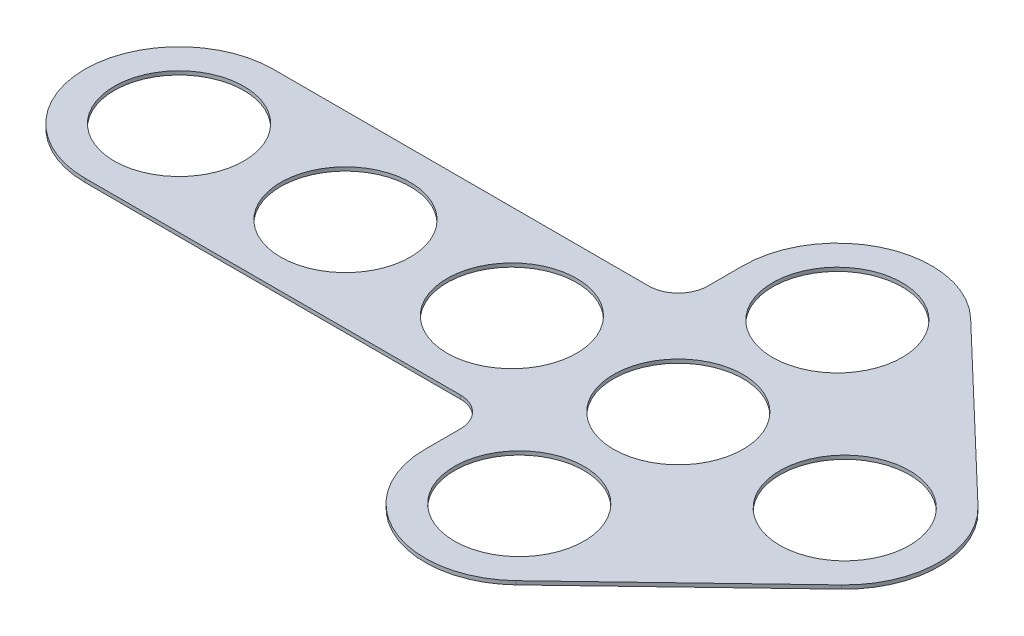
ISO-10303-21;
HEADER;
FILE_DESCRIPTION(('STEP AP214'),'2;1');
FILE_NAME('part.step','',(''),(''),'','','');
FILE_SCHEMA(('AUTOMOTIVE_DESIGN { 1 0 10303 214 1 1 1 1 }'));
ENDSEC;
DATA;
#1=APPLICATION_CONTEXT('core data for automotive mechanical design processes');
#2=APPLICATION_PROTOCOL_DEFINITION('international standard','automotive_design',2000,#1);
#3=PRODUCT_CONTEXT('',#1,'mechanical');
#4=PRODUCT('Part','Part','',(#3));
#5=PRODUCT_RELATED_PRODUCT_CATEGORY('part','',(#4));
#6=PRODUCT_DEFINITION_FORMATION('','',#4);
#7=PRODUCT_DEFINITION_CONTEXT('part definition',#1,'design');
#8=PRODUCT_DEFINITION('design','',#6,#7);
#9=PRODUCT_DEFINITION_SHAPE('','',#8);
#10=(LENGTH_UNIT() NAMED_UNIT(*) SI_UNIT(.MILLI.,.METRE.));
#11=(NAMED_UNIT(*) PLANE_ANGLE_UNIT() SI_UNIT($,.RADIAN.));
#12=(NAMED_UNIT(*) SI_UNIT($,.STERADIAN.) SOLID_ANGLE_UNIT());
#13=UNCERTAINTY_MEASURE_WITH_UNIT(LENGTH_MEASURE(1.E-05),#10,'distance_accuracy_value','');
#14=(GEOMETRIC_REPRESENTATION_CONTEXT(3) GLOBAL_UNCERTAINTY_ASSIGNED_CONTEXT((#13)) GLOBAL_UNIT_ASSIGNED_CONTEXT((#10,
#11,#12)) REPRESENTATION_CONTEXT('',''));
#15=CARTESIAN_POINT('',(0.,0.,0.));
#16=DIRECTION('',(0.,0.,1.));
#17=DIRECTION('',(1.,0.,0.));
#18=AXIS2_PLACEMENT_3D('',#15,#16,#17);
#19=CARTESIAN_POINT('',(518.16,3.175,-365.76));
#20=DIRECTION('',(0.,1.,0.));
#21=DIRECTION('',(0.,0.,1.));
#22=AXIS2_PLACEMENT_3D('',#19,#20,#21);
#23=PLANE('',#22);
#24=CARTESIAN_POINT('',(518.16,3.175,-365.76));
#25=DIRECTION('',(0.,1.,0.));
#26=DIRECTION('',(0.,0.,1.));
#27=AXIS2_PLACEMENT_3D('',#24,#25,#26);
#28=CIRCLE('',#27,55.88);
#29=CARTESIAN_POINT('',(518.16,3.175,-309.88));
#30=VERTEX_POINT('',#29);
#31=EDGE_CURVE('E424',#30,#30,#28,.T.);
#32=ORIENTED_EDGE('',*,*,#31,.F.);
#33=EDGE_LOOP('',(#32));
#34=FACE_BOUND('',#33,.T.);
#35=CARTESIAN_POINT('',(518.16,3.175,-228.6));
#36=DIRECTION('',(0.,1.,0.));
#37=DIRECTION('',(0.,0.,1.));
#38=AXIS2_PLACEMENT_3D('',#35,#36,#37);
#39=CIRCLE('',#38,55.88);
#40=CARTESIAN_POINT('',(518.16,3.175,-172.72));
#41=VERTEX_POINT('',#40);
#42=EDGE_CURVE('E443',#41,#41,#39,.T.);
#43=ORIENTED_EDGE('',*,*,#42,.F.);
#44=EDGE_LOOP('',(#43));
#45=FACE_BOUND('',#44,.T.);
#46=CARTESIAN_POINT('',(231.14,3.175,-228.6));
#47=DIRECTION('',(0.,1.,0.));
#48=DIRECTION('',(0.,0.,1.));
#49=AXIS2_PLACEMENT_3D('',#46,#47,#48);
#50=CIRCLE('',#49,55.88);
#51=CARTESIAN_POINT('',(231.14,3.175,-172.72));
#52=VERTEX_POINT('',#51);
#53=EDGE_CURVE('E455',#52,#52,#50,.T.);
#54=ORIENTED_EDGE('',*,*,#53,.F.);
#55=EDGE_LOOP('',(#54));
#56=FACE_BOUND('',#55,.T.);
#57=DIRECTION('',(0.,0.,1.));
#58=VECTOR('',#57,1.);
#59=CARTESIAN_POINT('',(436.88,3.175,-309.88));
#60=LINE('',#59,#58);
#61=CARTESIAN_POINT('',(436.88,3.175,-365.76));
#62=VERTEX_POINT('',#61);
#63=CARTESIAN_POINT('',(436.88,3.175,-335.28));
#64=VERTEX_POINT('',#63);
#65=EDGE_CURVE('E133',#62,#64,#60,.T.);
#66=ORIENTED_EDGE('',*,*,#65,.T.);
#67=CARTESIAN_POINT('',(411.48,3.175,-335.28));
#68=DIRECTION('',(0.,1.,0.));
#69=DIRECTION('',(0.,0.,1.));
#70=AXIS2_PLACEMENT_3D('',#67,#68,#69);
#71=CIRCLE('',#70,25.4);
#72=CARTESIAN_POINT('',(411.48,3.175,-309.88));
#73=VERTEX_POINT('',#72);
#74=EDGE_CURVE('E129',#64,#73,#71,.F.);
#75=ORIENTED_EDGE('',*,*,#74,.T.);
#76=DIRECTION('',(-1.,0.,0.));
#77=VECTOR('',#76,1.);
#78=CARTESIAN_POINT('',(87.63,3.175,-309.88));
#79=LINE('',#78,#77);
#80=CARTESIAN_POINT('',(87.63,3.175,-309.88));
#81=VERTEX_POINT('',#80);
#82=EDGE_CURVE('E121',#73,#81,#79,.T.);
#83=ORIENTED_EDGE('',*,*,#82,.T.);
#84=CARTESIAN_POINT('',(87.63,3.175,-228.6));
#85=DIRECTION('',(0.,1.,0.));
#86=DIRECTION('',(0.,0.,1.));
#87=AXIS2_PLACEMENT_3D('',#84,#85,#86);
#88=CIRCLE('',#87,81.28);
#89=CARTESIAN_POINT('',(87.63,3.175,-147.32));
#90=VERTEX_POINT('',#89);
#91=EDGE_CURVE('E126',#81,#90,#88,.T.);
#92=ORIENTED_EDGE('',*,*,#91,.T.);
#93=DIRECTION('',(1.,0.,0.));
#94=VECTOR('',#93,1.);
#95=CARTESIAN_POINT('',(436.88,3.175,-147.32));
#96=LINE('',#95,#94);
#97=CARTESIAN_POINT('',(411.48,3.175,-147.32));
#98=VERTEX_POINT('',#97);
#99=EDGE_CURVE('E147',#90,#98,#96,.T.);
#100=ORIENTED_EDGE('',*,*,#99,.T.);
#101=CARTESIAN_POINT('',(411.48,3.175,-121.92));
#102=DIRECTION('',(0.,1.,0.));
#103=DIRECTION('',(0.,0.,1.));
#104=AXIS2_PLACEMENT_3D('',#101,#102,#103);
#105=CIRCLE('',#104,25.4);
#106=CARTESIAN_POINT('',(436.88,3.175,-121.92));
#107=VERTEX_POINT('',#106);
#108=EDGE_CURVE('E11',#98,#107,#105,.F.);
#109=ORIENTED_EDGE('',*,*,#108,.T.);
#110=DIRECTION('',(0.,0.,1.));
#111=VECTOR('',#110,1.);
#112=CARTESIAN_POINT('',(436.88,3.175,-91.44));
#113=LINE('',#112,#111);
#114=CARTESIAN_POINT('',(436.88,3.175,-91.44));
#115=VERTEX_POINT('',#114);
#116=EDGE_CURVE('E149',#107,#115,#113,.T.);
#117=ORIENTED_EDGE('',*,*,#116,.T.);
#118=CARTESIAN_POINT('',(518.16,3.175,-91.44));
#119=DIRECTION('',(0.,1.,0.));
#120=DIRECTION('',(0.,0.,1.));
#121=AXIS2_PLACEMENT_3D('',#118,#119,#120);
#122=CIRCLE('',#121,81.2799999999999);
#123=CARTESIAN_POINT('',(574.31895953121,3.175,-32.6810886386417));
#124=VERTEX_POINT('',#123);
#125=EDGE_CURVE('E154',#115,#124,#122,.T.);
#126=ORIENTED_EDGE('',*,*,#125,.T.);
#127=DIRECTION('',(0.722919677182066,0.,-0.690932080846575));
#128=VECTOR('',#127,1.);
#129=CARTESIAN_POINT('',(717.82895953121,3.175,-169.841088638642));
#130=LINE('',#129,#128);
#131=CARTESIAN_POINT('',(717.82895953121,3.175,-169.841088638642));
#132=VERTEX_POINT('',#131);
#133=EDGE_CURVE('E156',#124,#132,#130,.T.);
#134=ORIENTED_EDGE('',*,*,#133,.T.);
#135=CARTESIAN_POINT('',(661.67,3.175,-228.6));
#136=DIRECTION('',(0.,1.,0.));
#137=DIRECTION('',(0.,0.,1.));
#138=AXIS2_PLACEMENT_3D('',#135,#136,#137);
#139=CIRCLE('',#138,81.28);
#140=CARTESIAN_POINT('',(717.82895953121,3.175,-287.358911361358));
#141=VERTEX_POINT('',#140);
#142=EDGE_CURVE('E158',#132,#141,#139,.T.);
#143=ORIENTED_EDGE('',*,*,#142,.T.);
#144=DIRECTION('',(-0.722919677182065,0.,-0.690932080846575));
#145=VECTOR('',#144,1.);
#146=CARTESIAN_POINT('',(574.31895953121,3.175,-424.518911361358));
#147=LINE('',#146,#145);
#148=CARTESIAN_POINT('',(574.31895953121,3.175,-424.518911361358));
#149=VERTEX_POINT('',#148);
#150=EDGE_CURVE('E160',#141,#149,#147,.T.);
#151=ORIENTED_EDGE('',*,*,#150,.T.);
#152=CARTESIAN_POINT('',(518.16,3.175,-365.76));
#153=DIRECTION('',(0.,1.,0.));
#154=DIRECTION('',(0.,0.,1.));
#155=AXIS2_PLACEMENT_3D('',#152,#153,#154);
#156=CIRCLE('',#155,81.28);
#157=EDGE_CURVE('E162',#149,#62,#156,.T.);
#158=ORIENTED_EDGE('',*,*,#157,.T.);
#159=EDGE_LOOP('',(#66,#75,#83,#92,#100,#109,#117,#126,#134,#143,#151,#158));
#160=FACE_BOUND('',#159,.T.);
#161=CARTESIAN_POINT('',(87.63,3.175,-228.6));
#162=DIRECTION('',(0.,1.,0.));
#163=DIRECTION('',(0.,0.,1.));
#164=AXIS2_PLACEMENT_3D('',#161,#162,#163);
#165=CIRCLE('',#164,55.88);
#166=CARTESIAN_POINT('',(87.63,3.175,-172.72));
#167=VERTEX_POINT('',#166);
#168=EDGE_CURVE('E168',#167,#167,#165,.T.);
#169=ORIENTED_EDGE('',*,*,#168,.F.);
#170=EDGE_LOOP('',(#169));
#171=FACE_BOUND('',#170,.T.);
#172=CARTESIAN_POINT('',(374.65,3.175,-228.6));
#173=DIRECTION('',(0.,1.,0.));
#174=DIRECTION('',(0.,0.,1.));
#175=AXIS2_PLACEMENT_3D('',#172,#173,#174);
#176=CIRCLE('',#175,55.88);
#177=CARTESIAN_POINT('',(374.65,3.175,-172.72));
#178=VERTEX_POINT('',#177);
#179=EDGE_CURVE('E449',#178,#178,#176,.T.);
#180=ORIENTED_EDGE('',*,*,#179,.F.);
#181=EDGE_LOOP('',(#180));
#182=FACE_BOUND('',#181,.T.);
#183=CARTESIAN_POINT('',(661.67,3.175,-228.6));
#184=DIRECTION('',(0.,1.,0.));
#185=DIRECTION('',(0.,0.,1.));
#186=AXIS2_PLACEMENT_3D('',#183,#184,#185);
#187=CIRCLE('',#186,55.88);
#188=CARTESIAN_POINT('',(661.67,3.175,-172.72));
#189=VERTEX_POINT('',#188);
#190=EDGE_CURVE('E437',#189,#189,#187,.T.);
#191=ORIENTED_EDGE('',*,*,#190,.F.);
#192=EDGE_LOOP('',(#191));
#193=FACE_BOUND('',#192,.T.);
#194=CARTESIAN_POINT('',(518.16,3.175,-91.44));
#195=DIRECTION('',(0.,1.,0.));
#196=DIRECTION('',(0.,0.,1.));
#197=AXIS2_PLACEMENT_3D('',#194,#195,#196);
#198=CIRCLE('',#197,55.88);
#199=CARTESIAN_POINT('',(518.16,3.175,-35.56));
#200=VERTEX_POINT('',#199);
#201=EDGE_CURVE('E428',#200,#200,#198,.T.);
#202=ORIENTED_EDGE('',*,*,#201,.F.);
#203=EDGE_LOOP('',(#202));
#204=FACE_BOUND('',#203,.T.);
#205=ADVANCED_FACE('F33',(#34,#45,#56,#160,#171,#182,#193,#204),#23,.T.);
#206=CARTESIAN_POINT('',(518.16,0.,-365.76));
#207=DIRECTION('',(0.,1.,0.));
#208=DIRECTION('',(0.,0.,1.));
#209=AXIS2_PLACEMENT_3D('',#206,#207,#208);
#210=PLANE('',#209);
#211=CARTESIAN_POINT('',(518.16,0.,-365.76));
#212=DIRECTION('',(0.,1.,0.));
#213=DIRECTION('',(0.,0.,1.));
#214=AXIS2_PLACEMENT_3D('',#211,#212,#213);
#215=CIRCLE('',#214,55.88);
#216=CARTESIAN_POINT('',(518.16,0.,-309.88));
#217=VERTEX_POINT('',#216);
#218=EDGE_CURVE('E427',#217,#217,#215,.T.);
#219=ORIENTED_EDGE('',*,*,#218,.T.);
#220=EDGE_LOOP('',(#219));
#221=FACE_BOUND('',#220,.T.);
#222=CARTESIAN_POINT('',(518.16,0.,-228.6));
#223=DIRECTION('',(0.,1.,0.));
#224=DIRECTION('',(0.,0.,1.));
#225=AXIS2_PLACEMENT_3D('',#222,#223,#224);
#226=CIRCLE('',#225,55.88);
#227=CARTESIAN_POINT('',(518.16,0.,-172.72));
#228=VERTEX_POINT('',#227);
#229=EDGE_CURVE('E440',#228,#228,#226,.T.);
#230=ORIENTED_EDGE('',*,*,#229,.T.);
#231=EDGE_LOOP('',(#230));
#232=FACE_BOUND('',#231,.T.);
#233=CARTESIAN_POINT('',(231.14,0.,-228.6));
#234=DIRECTION('',(0.,1.,0.));
#235=DIRECTION('',(0.,0.,1.));
#236=AXIS2_PLACEMENT_3D('',#233,#234,#235);
#237=CIRCLE('',#236,55.88);
#238=CARTESIAN_POINT('',(231.14,0.,-172.72));
#239=VERTEX_POINT('',#238);
#240=EDGE_CURVE('E452',#239,#239,#237,.T.);
#241=ORIENTED_EDGE('',*,*,#240,.T.);
#242=EDGE_LOOP('',(#241));
#243=FACE_BOUND('',#242,.T.);
#244=DIRECTION('',(0.,0.,1.));
#245=VECTOR('',#244,1.);
#246=CARTESIAN_POINT('',(436.88,0.,-309.88));
#247=LINE('',#246,#245);
#248=CARTESIAN_POINT('',(436.88,0.,-365.76));
#249=VERTEX_POINT('',#248);
#250=CARTESIAN_POINT('',(436.88,0.,-335.28));
#251=VERTEX_POINT('',#250);
#252=EDGE_CURVE('E165',#249,#251,#247,.T.);
#253=ORIENTED_EDGE('',*,*,#252,.F.);
#254=CARTESIAN_POINT('',(518.16,0.,-365.76));
#255=DIRECTION('',(0.,1.,0.));
#256=DIRECTION('',(0.,0.,1.));
#257=AXIS2_PLACEMENT_3D('',#254,#255,#256);
#258=CIRCLE('',#257,81.28);
#259=CARTESIAN_POINT('',(574.31895953121,0.,-424.518911361358));
#260=VERTEX_POINT('',#259);
#261=EDGE_CURVE('E184',#260,#249,#258,.T.);
#262=ORIENTED_EDGE('',*,*,#261,.F.);
#263=DIRECTION('',(-0.722919677182065,0.,-0.690932080846575));
#264=VECTOR('',#263,1.);
#265=CARTESIAN_POINT('',(574.31895953121,0.,-424.518911361358));
#266=LINE('',#265,#264);
#267=CARTESIAN_POINT('',(717.82895953121,0.,-287.358911361358));
#268=VERTEX_POINT('',#267);
#269=EDGE_CURVE('E182',#268,#260,#266,.T.);
#270=ORIENTED_EDGE('',*,*,#269,.F.);
#271=CARTESIAN_POINT('',(661.67,0.,-228.6));
#272=DIRECTION('',(0.,1.,0.));
#273=DIRECTION('',(0.,0.,1.));
#274=AXIS2_PLACEMENT_3D('',#271,#272,#273);
#275=CIRCLE('',#274,81.28);
#276=CARTESIAN_POINT('',(717.82895953121,0.,-169.841088638642));
#277=VERTEX_POINT('',#276);
#278=EDGE_CURVE('E180',#277,#268,#275,.T.);
#279=ORIENTED_EDGE('',*,*,#278,.F.);
#280=DIRECTION('',(0.722919677182066,0.,-0.690932080846575));
#281=VECTOR('',#280,1.);
#282=CARTESIAN_POINT('',(717.82895953121,0.,-169.841088638642));
#283=LINE('',#282,#281);
#284=CARTESIAN_POINT('',(574.31895953121,0.,-32.6810886386417));
#285=VERTEX_POINT('',#284);
#286=EDGE_CURVE('E178',#285,#277,#283,.T.);
#287=ORIENTED_EDGE('',*,*,#286,.F.);
#288=CARTESIAN_POINT('',(518.16,0.,-91.44));
#289=DIRECTION('',(0.,1.,0.));
#290=DIRECTION('',(0.,0.,1.));
#291=AXIS2_PLACEMENT_3D('',#288,#289,#290);
#292=CIRCLE('',#291,81.2799999999999);
#293=CARTESIAN_POINT('',(436.88,0.,-91.44));
#294=VERTEX_POINT('',#293);
#295=EDGE_CURVE('E176',#294,#285,#292,.T.);
#296=ORIENTED_EDGE('',*,*,#295,.F.);
#297=DIRECTION('',(0.,0.,1.));
#298=VECTOR('',#297,1.);
#299=CARTESIAN_POINT('',(436.88,0.,-91.44));
#300=LINE('',#299,#298);
#301=CARTESIAN_POINT('',(436.88,0.,-121.92));
#302=VERTEX_POINT('',#301);
#303=EDGE_CURVE('E174',#302,#294,#300,.T.);
#304=ORIENTED_EDGE('',*,*,#303,.F.);
#305=CARTESIAN_POINT('',(411.48,0.,-121.92));
#306=DIRECTION('',(0.,1.,0.));
#307=DIRECTION('',(0.,0.,1.));
#308=AXIS2_PLACEMENT_3D('',#305,#306,#307);
#309=CIRCLE('',#308,25.4);
#310=CARTESIAN_POINT('',(411.48,0.,-147.32));
#311=VERTEX_POINT('',#310);
#312=EDGE_CURVE('E41',#302,#311,#309,.T.);
#313=ORIENTED_EDGE('',*,*,#312,.T.);
#314=DIRECTION('',(1.,0.,0.));
#315=VECTOR('',#314,1.);
#316=CARTESIAN_POINT('',(436.88,0.,-147.32));
#317=LINE('',#316,#315);
#318=CARTESIAN_POINT('',(87.63,0.,-147.32));
#319=VERTEX_POINT('',#318);
#320=EDGE_CURVE('E172',#319,#311,#317,.T.);
#321=ORIENTED_EDGE('',*,*,#320,.F.);
#322=CARTESIAN_POINT('',(87.63,0.,-228.6));
#323=DIRECTION('',(0.,1.,0.));
#324=DIRECTION('',(0.,0.,1.));
#325=AXIS2_PLACEMENT_3D('',#322,#323,#324);
#326=CIRCLE('',#325,81.28);
#327=CARTESIAN_POINT('',(87.63,0.,-309.88));
#328=VERTEX_POINT('',#327);
#329=EDGE_CURVE('E170',#328,#319,#326,.T.);
#330=ORIENTED_EDGE('',*,*,#329,.F.);
#331=DIRECTION('',(-1.,0.,0.));
#332=VECTOR('',#331,1.);
#333=CARTESIAN_POINT('',(87.63,0.,-309.88));
#334=LINE('',#333,#332);
#335=CARTESIAN_POINT('',(411.48,0.,-309.88));
#336=VERTEX_POINT('',#335);
#337=EDGE_CURVE('E139',#336,#328,#334,.T.);
#338=ORIENTED_EDGE('',*,*,#337,.F.);
#339=CARTESIAN_POINT('',(411.48,0.,-335.28));
#340=DIRECTION('',(0.,1.,0.));
#341=DIRECTION('',(0.,0.,1.));
#342=AXIS2_PLACEMENT_3D('',#339,#340,#341);
#343=CIRCLE('',#342,25.4);
#344=EDGE_CURVE('E211',#336,#251,#343,.T.);
#345=ORIENTED_EDGE('',*,*,#344,.T.);
#346=EDGE_LOOP('',(#253,#262,#270,#279,#287,#296,#304,#313,#321,#330,#338,#345));
#347=FACE_BOUND('',#346,.T.);
#348=CARTESIAN_POINT('',(87.63,0.,-228.6));
#349=DIRECTION('',(0.,1.,0.));
#350=DIRECTION('',(0.,0.,1.));
#351=AXIS2_PLACEMENT_3D('',#348,#349,#350);
#352=CIRCLE('',#351,55.88);
#353=CARTESIAN_POINT('',(87.63,0.,-172.72));
#354=VERTEX_POINT('',#353);
#355=EDGE_CURVE('E458',#354,#354,#352,.T.);
#356=ORIENTED_EDGE('',*,*,#355,.T.);
#357=EDGE_LOOP('',(#356));
#358=FACE_BOUND('',#357,.T.);
#359=CARTESIAN_POINT('',(374.65,0.,-228.6));
#360=DIRECTION('',(0.,1.,0.));
#361=DIRECTION('',(0.,0.,1.));
#362=AXIS2_PLACEMENT_3D('',#359,#360,#361);
#363=CIRCLE('',#362,55.88);
#364=CARTESIAN_POINT('',(374.65,0.,-172.72));
#365=VERTEX_POINT('',#364);
#366=EDGE_CURVE('E446',#365,#365,#363,.T.);
#367=ORIENTED_EDGE('',*,*,#366,.T.);
#368=EDGE_LOOP('',(#367));
#369=FACE_BOUND('',#368,.T.);
#370=CARTESIAN_POINT('',(661.67,0.,-228.6));
#371=DIRECTION('',(0.,1.,0.));
#372=DIRECTION('',(0.,0.,1.));
#373=AXIS2_PLACEMENT_3D('',#370,#371,#372);
#374=CIRCLE('',#373,55.88);
#375=CARTESIAN_POINT('',(661.67,0.,-172.72));
#376=VERTEX_POINT('',#375);
#377=EDGE_CURVE('E430',#376,#376,#374,.T.);
#378=ORIENTED_EDGE('',*,*,#377,.T.);
#379=EDGE_LOOP('',(#378));
#380=FACE_BOUND('',#379,.T.);
#381=CARTESIAN_POINT('',(518.16,0.,-91.44));
#382=DIRECTION('',(0.,1.,0.));
#383=DIRECTION('',(0.,0.,1.));
#384=AXIS2_PLACEMENT_3D('',#381,#382,#383);
#385=CIRCLE('',#384,55.88);
#386=CARTESIAN_POINT('',(518.16,0.,-35.56));
#387=VERTEX_POINT('',#386);
#388=EDGE_CURVE('E433',#387,#387,#385,.T.);
#389=ORIENTED_EDGE('',*,*,#388,.T.);
#390=EDGE_LOOP('',(#389));
#391=FACE_BOUND('',#390,.T.);
#392=ADVANCED_FACE('F214',(#221,#232,#243,#347,#358,#369,#380,#391),#210,.F.);
#393=CARTESIAN_POINT('',(436.88,3.175,-309.88));
#394=DIRECTION('',(1.,0.,0.));
#395=DIRECTION('',(0.,0.,-1.));
#396=AXIS2_PLACEMENT_3D('',#393,#394,#395);
#397=PLANE('',#396);
#398=ORIENTED_EDGE('',*,*,#252,.T.);
#399=DIRECTION('',(0.,-1.,0.));
#400=VECTOR('',#399,1.);
#401=CARTESIAN_POINT('',(436.88,3.175,-335.28));
#402=LINE('',#401,#400);
#403=EDGE_CURVE('E205',#251,#64,#402,.F.);
#404=ORIENTED_EDGE('',*,*,#403,.T.);
#405=ORIENTED_EDGE('',*,*,#65,.F.);
#406=DIRECTION('',(0.,-1.,0.));
#407=VECTOR('',#406,1.);
#408=CARTESIAN_POINT('',(436.88,3.175,-365.76));
#409=LINE('',#408,#407);
#410=EDGE_CURVE('E164',#62,#249,#409,.T.);
#411=ORIENTED_EDGE('',*,*,#410,.T.);
#412=EDGE_LOOP('',(#398,#404,#405,#411));
#413=FACE_BOUND('',#412,.T.);
#414=ADVANCED_FACE('F220',(#413),#397,.F.);
#415=CARTESIAN_POINT('',(87.63,3.175,-309.88));
#416=DIRECTION('',(0.,0.,1.));
#417=DIRECTION('',(1.,0.,0.));
#418=AXIS2_PLACEMENT_3D('',#415,#416,#417);
#419=PLANE('',#418);
#420=ORIENTED_EDGE('',*,*,#82,.F.);
#421=DIRECTION('',(0.,-1.,0.));
#422=VECTOR('',#421,1.);
#423=CARTESIAN_POINT('',(411.48,0.,-309.88));
#424=LINE('',#423,#422);
#425=EDGE_CURVE('E142',#73,#336,#424,.T.);
#426=ORIENTED_EDGE('',*,*,#425,.T.);
#427=ORIENTED_EDGE('',*,*,#337,.T.);
#428=DIRECTION('',(0.,-1.,0.));
#429=VECTOR('',#428,1.);
#430=CARTESIAN_POINT('',(87.63,3.175,-309.88));
#431=LINE('',#430,#429);
#432=EDGE_CURVE('E136',#81,#328,#431,.T.);
#433=ORIENTED_EDGE('',*,*,#432,.F.);
#434=EDGE_LOOP('',(#420,#426,#427,#433));
#435=FACE_BOUND('',#434,.T.);
#436=ADVANCED_FACE('F137',(#435),#419,.F.);
#437=CARTESIAN_POINT('',(87.63,3.175,-228.6));
#438=DIRECTION('',(0.,-1.,0.));
#439=DIRECTION('',(0.,0.,-1.));
#440=AXIS2_PLACEMENT_3D('',#437,#438,#439);
#441=CYLINDRICAL_SURFACE('',#440,81.28);
#442=ORIENTED_EDGE('',*,*,#329,.T.);
#443=DIRECTION('',(0.,-1.,0.));
#444=VECTOR('',#443,1.);
#445=CARTESIAN_POINT('',(87.63,3.175,-147.32));
#446=LINE('',#445,#444);
#447=EDGE_CURVE('E143',#90,#319,#446,.T.);
#448=ORIENTED_EDGE('',*,*,#447,.F.);
#449=ORIENTED_EDGE('',*,*,#91,.F.);
#450=ORIENTED_EDGE('',*,*,#432,.T.);
#451=EDGE_LOOP('',(#442,#448,#449,#450));
#452=FACE_BOUND('',#451,.T.);
#453=ADVANCED_FACE('F145',(#452),#441,.T.);
#454=CARTESIAN_POINT('',(436.88,3.175,-147.32));
#455=DIRECTION('',(0.,0.,-1.));
#456=DIRECTION('',(-1.,0.,0.));
#457=AXIS2_PLACEMENT_3D('',#454,#455,#456);
#458=PLANE('',#457);
#459=ORIENTED_EDGE('',*,*,#320,.T.);
#460=DIRECTION('',(0.,-1.,0.));
#461=VECTOR('',#460,1.);
#462=CARTESIAN_POINT('',(411.48,3.175,-147.32));
#463=LINE('',#462,#461);
#464=EDGE_CURVE('E48',#311,#98,#463,.F.);
#465=ORIENTED_EDGE('',*,*,#464,.T.);
#466=ORIENTED_EDGE('',*,*,#99,.F.);
#467=ORIENTED_EDGE('',*,*,#447,.T.);
#468=EDGE_LOOP('',(#459,#465,#466,#467));
#469=FACE_BOUND('',#468,.T.);
#470=ADVANCED_FACE('F272',(#469),#458,.F.);
#471=CARTESIAN_POINT('',(436.88,3.175,-91.44));
#472=DIRECTION('',(1.,0.,0.));
#473=DIRECTION('',(0.,0.,-1.));
#474=AXIS2_PLACEMENT_3D('',#471,#472,#473);
#475=PLANE('',#474);
#476=ORIENTED_EDGE('',*,*,#116,.F.);
#477=DIRECTION('',(0.,-1.,0.));
#478=VECTOR('',#477,1.);
#479=CARTESIAN_POINT('',(436.88,0.,-121.92));
#480=LINE('',#479,#478);
#481=EDGE_CURVE('E207',#107,#302,#480,.T.);
#482=ORIENTED_EDGE('',*,*,#481,.T.);
#483=ORIENTED_EDGE('',*,*,#303,.T.);
#484=DIRECTION('',(0.,-1.,0.));
#485=VECTOR('',#484,1.);
#486=CARTESIAN_POINT('',(436.88,3.175,-91.44));
#487=LINE('',#486,#485);
#488=EDGE_CURVE('E200',#115,#294,#487,.T.);
#489=ORIENTED_EDGE('',*,*,#488,.F.);
#490=EDGE_LOOP('',(#476,#482,#483,#489));
#491=FACE_BOUND('',#490,.T.);
#492=ADVANCED_FACE('F268',(#491),#475,.F.);
#493=CARTESIAN_POINT('',(518.16,3.175,-91.44));
#494=DIRECTION('',(0.,-1.,0.));
#495=DIRECTION('',(0.,0.,-1.));
#496=AXIS2_PLACEMENT_3D('',#493,#494,#495);
#497=CYLINDRICAL_SURFACE('',#496,81.2799999999999);
#498=ORIENTED_EDGE('',*,*,#295,.T.);
#499=DIRECTION('',(0.,-1.,0.));
#500=VECTOR('',#499,1.);
#501=CARTESIAN_POINT('',(574.31895953121,3.175,-32.6810886386417));
#502=LINE('',#501,#500);
#503=EDGE_CURVE('E197',#124,#285,#502,.T.);
#504=ORIENTED_EDGE('',*,*,#503,.F.);
#505=ORIENTED_EDGE('',*,*,#125,.F.);
#506=ORIENTED_EDGE('',*,*,#488,.T.);
#507=EDGE_LOOP('',(#498,#504,#505,#506));
#508=FACE_BOUND('',#507,.T.);
#509=ADVANCED_FACE('F264',(#508),#497,.T.);
#510=CARTESIAN_POINT('',(717.82895953121,3.175,-169.841088638642));
#511=DIRECTION('',(-0.690932080846575,0.,-0.722919677182066));
#512=DIRECTION('',(-0.722919677182066,0.,0.690932080846575));
#513=AXIS2_PLACEMENT_3D('',#510,#511,#512);
#514=PLANE('',#513);
#515=ORIENTED_EDGE('',*,*,#286,.T.);
#516=DIRECTION('',(0.,-1.,0.));
#517=VECTOR('',#516,1.);
#518=CARTESIAN_POINT('',(717.82895953121,3.175,-169.841088638642));
#519=LINE('',#518,#517);
#520=EDGE_CURVE('E194',#132,#277,#519,.T.);
#521=ORIENTED_EDGE('',*,*,#520,.F.);
#522=ORIENTED_EDGE('',*,*,#133,.F.);
#523=ORIENTED_EDGE('',*,*,#503,.T.);
#524=EDGE_LOOP('',(#515,#521,#522,#523));
#525=FACE_BOUND('',#524,.T.);
#526=ADVANCED_FACE('F260',(#525),#514,.F.);
#527=CARTESIAN_POINT('',(661.67,3.175,-228.6));
#528=DIRECTION('',(0.,-1.,0.));
#529=DIRECTION('',(0.,0.,-1.));
#530=AXIS2_PLACEMENT_3D('',#527,#528,#529);
#531=CYLINDRICAL_SURFACE('',#530,81.28);
#532=ORIENTED_EDGE('',*,*,#278,.T.);
#533=DIRECTION('',(0.,-1.,0.));
#534=VECTOR('',#533,1.);
#535=CARTESIAN_POINT('',(717.82895953121,3.175,-287.358911361358));
#536=LINE('',#535,#534);
#537=EDGE_CURVE('E191',#141,#268,#536,.T.);
#538=ORIENTED_EDGE('',*,*,#537,.F.);
#539=ORIENTED_EDGE('',*,*,#142,.F.);
#540=ORIENTED_EDGE('',*,*,#520,.T.);
#541=EDGE_LOOP('',(#532,#538,#539,#540));
#542=FACE_BOUND('',#541,.T.);
#543=ADVANCED_FACE('F256',(#542),#531,.T.);
#544=CARTESIAN_POINT('',(574.31895953121,3.175,-424.518911361358));
#545=DIRECTION('',(-0.690932080846575,0.,0.722919677182065));
#546=DIRECTION('',(0.722919677182065,0.,0.690932080846575));
#547=AXIS2_PLACEMENT_3D('',#544,#545,#546);
#548=PLANE('',#547);
#549=ORIENTED_EDGE('',*,*,#269,.T.);
#550=DIRECTION('',(0.,-1.,0.));
#551=VECTOR('',#550,1.);
#552=CARTESIAN_POINT('',(574.31895953121,3.175,-424.518911361358));
#553=LINE('',#552,#551);
#554=EDGE_CURVE('E188',#149,#260,#553,.T.);
#555=ORIENTED_EDGE('',*,*,#554,.F.);
#556=ORIENTED_EDGE('',*,*,#150,.F.);
#557=ORIENTED_EDGE('',*,*,#537,.T.);
#558=EDGE_LOOP('',(#549,#555,#556,#557));
#559=FACE_BOUND('',#558,.T.);
#560=ADVANCED_FACE('F252',(#559),#548,.F.);
#561=CARTESIAN_POINT('',(518.16,3.175,-365.76));
#562=DIRECTION('',(0.,-1.,0.));
#563=DIRECTION('',(0.,0.,-1.));
#564=AXIS2_PLACEMENT_3D('',#561,#562,#563);
#565=CYLINDRICAL_SURFACE('',#564,81.28);
#566=ORIENTED_EDGE('',*,*,#261,.T.);
#567=ORIENTED_EDGE('',*,*,#410,.F.);
#568=ORIENTED_EDGE('',*,*,#157,.F.);
#569=ORIENTED_EDGE('',*,*,#554,.T.);
#570=EDGE_LOOP('',(#566,#567,#568,#569));
#571=FACE_BOUND('',#570,.T.);
#572=ADVANCED_FACE('F249',(#571),#565,.T.);
#573=CARTESIAN_POINT('',(87.63,3.175,-228.6));
#574=DIRECTION('',(0.,-1.,0.));
#575=DIRECTION('',(0.,0.,-1.));
#576=AXIS2_PLACEMENT_3D('',#573,#574,#575);
#577=CYLINDRICAL_SURFACE('',#576,55.88);
#578=ORIENTED_EDGE('',*,*,#168,.T.);
#579=EDGE_LOOP('',(#578));
#580=FACE_BOUND('',#579,.T.);
#581=ORIENTED_EDGE('',*,*,#355,.F.);
#582=EDGE_LOOP('',(#581));
#583=FACE_BOUND('',#582,.T.);
#584=ADVANCED_FACE('F246',(#580,#583),#577,.F.);
#585=CARTESIAN_POINT('',(231.14,3.175,-228.6));
#586=DIRECTION('',(0.,-1.,0.));
#587=DIRECTION('',(0.,0.,-1.));
#588=AXIS2_PLACEMENT_3D('',#585,#586,#587);
#589=CYLINDRICAL_SURFACE('',#588,55.88);
#590=ORIENTED_EDGE('',*,*,#53,.T.);
#591=EDGE_LOOP('',(#590));
#592=FACE_BOUND('',#591,.T.);
#593=ORIENTED_EDGE('',*,*,#240,.F.);
#594=EDGE_LOOP('',(#593));
#595=FACE_BOUND('',#594,.T.);
#596=ADVANCED_FACE('F326',(#592,#595),#589,.F.);
#597=CARTESIAN_POINT('',(374.65,3.175,-228.6));
#598=DIRECTION('',(0.,-1.,0.));
#599=DIRECTION('',(0.,0.,-1.));
#600=AXIS2_PLACEMENT_3D('',#597,#598,#599);
#601=CYLINDRICAL_SURFACE('',#600,55.88);
#602=ORIENTED_EDGE('',*,*,#179,.T.);
#603=EDGE_LOOP('',(#602));
#604=FACE_BOUND('',#603,.T.);
#605=ORIENTED_EDGE('',*,*,#366,.F.);
#606=EDGE_LOOP('',(#605));
#607=FACE_BOUND('',#606,.T.);
#608=ADVANCED_FACE('F333',(#604,#607),#601,.F.);
#609=CARTESIAN_POINT('',(518.16,3.175,-228.6));
#610=DIRECTION('',(0.,-1.,0.));
#611=DIRECTION('',(0.,0.,-1.));
#612=AXIS2_PLACEMENT_3D('',#609,#610,#611);
#613=CYLINDRICAL_SURFACE('',#612,55.88);
#614=ORIENTED_EDGE('',*,*,#42,.T.);
#615=EDGE_LOOP('',(#614));
#616=FACE_BOUND('',#615,.T.);
#617=ORIENTED_EDGE('',*,*,#229,.F.);
#618=EDGE_LOOP('',(#617));
#619=FACE_BOUND('',#618,.T.);
#620=ADVANCED_FACE('F340',(#616,#619),#613,.F.);
#621=CARTESIAN_POINT('',(661.67,3.175,-228.6));
#622=DIRECTION('',(0.,-1.,0.));
#623=DIRECTION('',(0.,0.,-1.));
#624=AXIS2_PLACEMENT_3D('',#621,#622,#623);
#625=CYLINDRICAL_SURFACE('',#624,55.88);
#626=ORIENTED_EDGE('',*,*,#190,.T.);
#627=EDGE_LOOP('',(#626));
#628=FACE_BOUND('',#627,.T.);
#629=ORIENTED_EDGE('',*,*,#377,.F.);
#630=EDGE_LOOP('',(#629));
#631=FACE_BOUND('',#630,.T.);
#632=ADVANCED_FACE('F348',(#628,#631),#625,.F.);
#633=CARTESIAN_POINT('',(518.16,3.175,-365.76));
#634=DIRECTION('',(0.,-1.,0.));
#635=DIRECTION('',(0.,0.,-1.));
#636=AXIS2_PLACEMENT_3D('',#633,#634,#635);
#637=CYLINDRICAL_SURFACE('',#636,55.88);
#638=ORIENTED_EDGE('',*,*,#31,.T.);
#639=EDGE_LOOP('',(#638));
#640=FACE_BOUND('',#639,.T.);
#641=ORIENTED_EDGE('',*,*,#218,.F.);
#642=EDGE_LOOP('',(#641));
#643=FACE_BOUND('',#642,.T.);
#644=ADVANCED_FACE('F231',(#640,#643),#637,.F.);
#645=CARTESIAN_POINT('',(518.16,3.175,-91.44));
#646=DIRECTION('',(0.,-1.,0.));
#647=DIRECTION('',(0.,0.,-1.));
#648=AXIS2_PLACEMENT_3D('',#645,#646,#647);
#649=CYLINDRICAL_SURFACE('',#648,55.88);
#650=ORIENTED_EDGE('',*,*,#201,.T.);
#651=EDGE_LOOP('',(#650));
#652=FACE_BOUND('',#651,.T.);
#653=ORIENTED_EDGE('',*,*,#388,.F.);
#654=EDGE_LOOP('',(#653));
#655=FACE_BOUND('',#654,.T.);
#656=ADVANCED_FACE('F225',(#652,#655),#649,.F.);
#657=CARTESIAN_POINT('',(411.48,3.175,-335.28));
#658=DIRECTION('',(0.,1.,0.));
#659=DIRECTION('',(0.,0.,1.));
#660=AXIS2_PLACEMENT_3D('',#657,#658,#659);
#661=CYLINDRICAL_SURFACE('',#660,25.4);
#662=ORIENTED_EDGE('',*,*,#74,.F.);
#663=ORIENTED_EDGE('',*,*,#403,.F.);
#664=ORIENTED_EDGE('',*,*,#344,.F.);
#665=ORIENTED_EDGE('',*,*,#425,.F.);
#666=EDGE_LOOP('',(#662,#663,#664,#665));
#667=FACE_BOUND('',#666,.T.);
#668=ADVANCED_FACE('F223',(#667),#661,.F.);
#669=CARTESIAN_POINT('',(411.48,3.175,-121.92));
#670=DIRECTION('',(0.,1.,0.));
#671=DIRECTION('',(0.,0.,1.));
#672=AXIS2_PLACEMENT_3D('',#669,#670,#671);
#673=CYLINDRICAL_SURFACE('',#672,25.4);
#674=ORIENTED_EDGE('',*,*,#108,.F.);
#675=ORIENTED_EDGE('',*,*,#464,.F.);
#676=ORIENTED_EDGE('',*,*,#312,.F.);
#677=ORIENTED_EDGE('',*,*,#481,.F.);
#678=EDGE_LOOP('',(#674,#675,#676,#677));
#679=FACE_BOUND('',#678,.T.);
#680=ADVANCED_FACE('F35',(#679),#673,.F.);
#681=CLOSED_SHELL('',(#205,#392,#414,#436,#453,#470,#492,#509,#526,#543,#560,#572,#584,#596,
#608,#620,#632,#644,#656,#668,#680));
#682=MANIFOLD_SOLID_BREP('B2',#681);
#683=ADVANCED_BREP_SHAPE_REPRESENTATION('',(#18,#682),#14);
#684=SHAPE_DEFINITION_REPRESENTATION(#9,#683);
ENDSEC;
END-ISO-10303-21;
